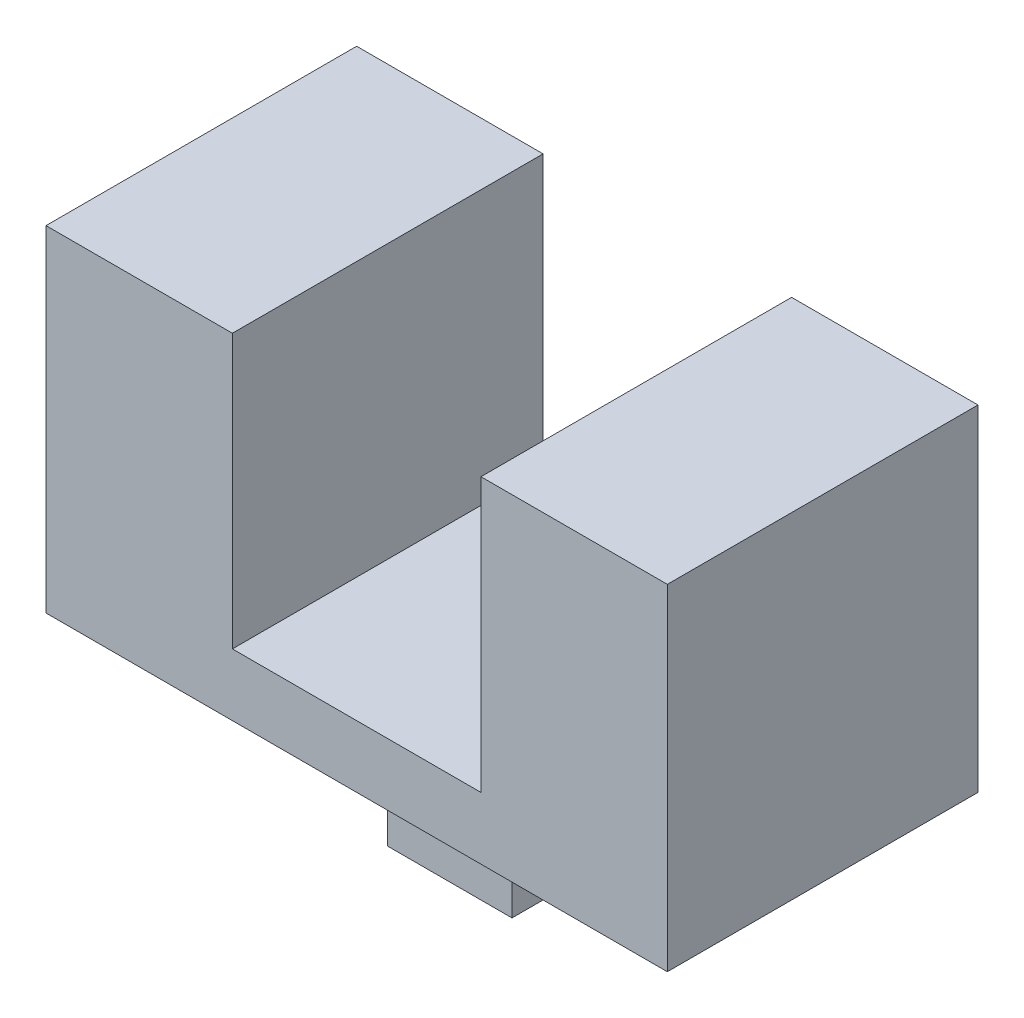
ISO-10303-21;
HEADER;
FILE_DESCRIPTION(('STEP AP214'),'2;1');
FILE_NAME('part.step','',(''),(''),'','','');
FILE_SCHEMA(('AUTOMOTIVE_DESIGN { 1 0 10303 214 1 1 1 1 }'));
ENDSEC;
DATA;
#1=APPLICATION_CONTEXT('core data for automotive mechanical design processes');
#2=APPLICATION_PROTOCOL_DEFINITION('international standard','automotive_design',2000,#1);
#3=PRODUCT_CONTEXT('',#1,'mechanical');
#4=PRODUCT('Part','Part','',(#3));
#5=PRODUCT_RELATED_PRODUCT_CATEGORY('part','',(#4));
#6=PRODUCT_DEFINITION_FORMATION('','',#4);
#7=PRODUCT_DEFINITION_CONTEXT('part definition',#1,'design');
#8=PRODUCT_DEFINITION('design','',#6,#7);
#9=PRODUCT_DEFINITION_SHAPE('','',#8);
#10=(LENGTH_UNIT() NAMED_UNIT(*) SI_UNIT(.MILLI.,.METRE.));
#11=(NAMED_UNIT(*) PLANE_ANGLE_UNIT() SI_UNIT($,.RADIAN.));
#12=(NAMED_UNIT(*) SI_UNIT($,.STERADIAN.) SOLID_ANGLE_UNIT());
#13=UNCERTAINTY_MEASURE_WITH_UNIT(LENGTH_MEASURE(1.E-05),#10,'distance_accuracy_value','');
#14=(GEOMETRIC_REPRESENTATION_CONTEXT(3) GLOBAL_UNCERTAINTY_ASSIGNED_CONTEXT((#13)) GLOBAL_UNIT_ASSIGNED_CONTEXT((#10,
#11,#12)) REPRESENTATION_CONTEXT('',''));
#15=CARTESIAN_POINT('',(0.,0.,0.));
#16=DIRECTION('',(0.,0.,1.));
#17=DIRECTION('',(1.,0.,0.));
#18=AXIS2_PLACEMENT_3D('',#15,#16,#17);
#19=CARTESIAN_POINT('',(6.35,-3.429,6.35));
#20=DIRECTION('',(0.,1.,0.));
#21=DIRECTION('',(-1.,0.,0.));
#22=AXIS2_PLACEMENT_3D('',#19,#20,#21);
#23=PLANE('',#22);
#24=DIRECTION('',(1.,0.,0.));
#25=VECTOR('',#24,1.);
#26=CARTESIAN_POINT('',(6.35,-3.429,0.));
#27=LINE('',#26,#25);
#28=CARTESIAN_POINT('',(-6.35,-3.429,0.));
#29=VERTEX_POINT('',#28);
#30=CARTESIAN_POINT('',(6.35,-3.429,0.));
#31=VERTEX_POINT('',#30);
#32=EDGE_CURVE('E172',#29,#31,#27,.T.);
#33=ORIENTED_EDGE('',*,*,#32,.T.);
#34=DIRECTION('',(0.,0.,-1.));
#35=VECTOR('',#34,1.);
#36=CARTESIAN_POINT('',(6.35,-3.429,6.35));
#37=LINE('',#36,#35);
#38=CARTESIAN_POINT('',(6.35,-3.429,6.35));
#39=VERTEX_POINT('',#38);
#40=EDGE_CURVE('E197',#39,#31,#37,.T.);
#41=ORIENTED_EDGE('',*,*,#40,.F.);
#42=DIRECTION('',(1.,0.,0.));
#43=VECTOR('',#42,1.);
#44=CARTESIAN_POINT('',(6.35,-3.429,6.35));
#45=LINE('',#44,#43);
#46=CARTESIAN_POINT('',(-6.35,-3.429,6.35));
#47=VERTEX_POINT('',#46);
#48=EDGE_CURVE('E158',#47,#39,#45,.T.);
#49=ORIENTED_EDGE('',*,*,#48,.F.);
#50=DIRECTION('',(0.,0.,-1.));
#51=VECTOR('',#50,1.);
#52=CARTESIAN_POINT('',(-6.35,-3.429,6.35));
#53=LINE('',#52,#51);
#54=EDGE_CURVE('E42',#47,#29,#53,.T.);
#55=ORIENTED_EDGE('',*,*,#54,.T.);
#56=EDGE_LOOP('',(#33,#41,#49,#55));
#57=FACE_BOUND('',#56,.T.);
#58=DIRECTION('',(0.,0.,1.));
#59=VECTOR('',#58,1.);
#60=CARTESIAN_POINT('',(1.27,-3.429,1.905));
#61=LINE('',#60,#59);
#62=CARTESIAN_POINT('',(1.27,-3.429,1.905));
#63=VERTEX_POINT('',#62);
#64=CARTESIAN_POINT('',(1.27,-3.429,4.445));
#65=VERTEX_POINT('',#64);
#66=EDGE_CURVE('E49',#63,#65,#61,.T.);
#67=ORIENTED_EDGE('',*,*,#66,.F.);
#68=DIRECTION('',(1.,0.,0.));
#69=VECTOR('',#68,1.);
#70=CARTESIAN_POINT('',(-1.27,-3.429,1.905));
#71=LINE('',#70,#69);
#72=CARTESIAN_POINT('',(-1.27,-3.429,1.905));
#73=VERTEX_POINT('',#72);
#74=EDGE_CURVE('E53',#73,#63,#71,.T.);
#75=ORIENTED_EDGE('',*,*,#74,.F.);
#76=DIRECTION('',(0.,0.,-1.));
#77=VECTOR('',#76,1.);
#78=CARTESIAN_POINT('',(-1.27,-3.429,1.905));
#79=LINE('',#78,#77);
#80=CARTESIAN_POINT('',(-1.27,-3.429,4.445));
#81=VERTEX_POINT('',#80);
#82=EDGE_CURVE('E353',#81,#73,#79,.T.);
#83=ORIENTED_EDGE('',*,*,#82,.F.);
#84=DIRECTION('',(-1.,0.,0.));
#85=VECTOR('',#84,1.);
#86=CARTESIAN_POINT('',(-1.27,-3.429,4.445));
#87=LINE('',#86,#85);
#88=EDGE_CURVE('E359',#65,#81,#87,.T.);
#89=ORIENTED_EDGE('',*,*,#88,.F.);
#90=EDGE_LOOP('',(#67,#75,#83,#89));
#91=FACE_BOUND('',#90,.T.);
#92=ADVANCED_FACE('F34',(#57,#91),#23,.F.);
#93=CARTESIAN_POINT('',(-2.54,3.429,6.35));
#94=DIRECTION('',(0.,-1.,0.));
#95=DIRECTION('',(1.,0.,0.));
#96=AXIS2_PLACEMENT_3D('',#93,#94,#95);
#97=PLANE('',#96);
#98=DIRECTION('',(-1.,0.,0.));
#99=VECTOR('',#98,1.);
#100=CARTESIAN_POINT('',(-2.54,3.429,0.));
#101=LINE('',#100,#99);
#102=CARTESIAN_POINT('',(-2.54,3.429,0.));
#103=VERTEX_POINT('',#102);
#104=CARTESIAN_POINT('',(-6.35,3.429,0.));
#105=VERTEX_POINT('',#104);
#106=EDGE_CURVE('E143',#103,#105,#101,.T.);
#107=ORIENTED_EDGE('',*,*,#106,.T.);
#108=DIRECTION('',(0.,0.,-1.));
#109=VECTOR('',#108,1.);
#110=CARTESIAN_POINT('',(-6.35,3.429,6.35));
#111=LINE('',#110,#109);
#112=CARTESIAN_POINT('',(-6.35,3.429,6.35));
#113=VERTEX_POINT('',#112);
#114=EDGE_CURVE('E11',#113,#105,#111,.T.);
#115=ORIENTED_EDGE('',*,*,#114,.F.);
#116=DIRECTION('',(-1.,0.,0.));
#117=VECTOR('',#116,1.);
#118=CARTESIAN_POINT('',(-2.54,3.429,6.35));
#119=LINE('',#118,#117);
#120=CARTESIAN_POINT('',(-2.54,3.429,6.35));
#121=VERTEX_POINT('',#120);
#122=EDGE_CURVE('E152',#121,#113,#119,.T.);
#123=ORIENTED_EDGE('',*,*,#122,.F.);
#124=DIRECTION('',(0.,0.,-1.));
#125=VECTOR('',#124,1.);
#126=CARTESIAN_POINT('',(-2.54,3.429,6.35));
#127=LINE('',#126,#125);
#128=EDGE_CURVE('E169',#121,#103,#127,.T.);
#129=ORIENTED_EDGE('',*,*,#128,.T.);
#130=EDGE_LOOP('',(#107,#115,#123,#129));
#131=FACE_BOUND('',#130,.T.);
#132=ADVANCED_FACE('F36',(#131),#97,.F.);
#133=CARTESIAN_POINT('',(-6.35,-3.429,6.35));
#134=DIRECTION('',(1.,0.,0.));
#135=DIRECTION('',(0.,0.,-1.));
#136=AXIS2_PLACEMENT_3D('',#133,#134,#135);
#137=PLANE('',#136);
#138=DIRECTION('',(0.,-1.,0.));
#139=VECTOR('',#138,1.);
#140=CARTESIAN_POINT('',(-6.35,-3.429,0.));
#141=LINE('',#140,#139);
#142=EDGE_CURVE('E146',#105,#29,#141,.T.);
#143=ORIENTED_EDGE('',*,*,#142,.T.);
#144=ORIENTED_EDGE('',*,*,#54,.F.);
#145=DIRECTION('',(0.,-1.,0.));
#146=VECTOR('',#145,1.);
#147=CARTESIAN_POINT('',(-6.35,-3.429,6.35));
#148=LINE('',#147,#146);
#149=EDGE_CURVE('E155',#113,#47,#148,.T.);
#150=ORIENTED_EDGE('',*,*,#149,.F.);
#151=ORIENTED_EDGE('',*,*,#114,.T.);
#152=EDGE_LOOP('',(#143,#144,#150,#151));
#153=FACE_BOUND('',#152,.T.);
#154=ADVANCED_FACE('F226',(#153),#137,.F.);
#155=CARTESIAN_POINT('',(6.35,-3.429,6.35));
#156=DIRECTION('',(-1.,0.,0.));
#157=DIRECTION('',(0.,0.,1.));
#158=AXIS2_PLACEMENT_3D('',#155,#156,#157);
#159=PLANE('',#158);
#160=DIRECTION('',(0.,1.,0.));
#161=VECTOR('',#160,1.);
#162=CARTESIAN_POINT('',(6.35,-3.429,0.));
#163=LINE('',#162,#161);
#164=CARTESIAN_POINT('',(6.35,3.429,0.));
#165=VERTEX_POINT('',#164);
#166=EDGE_CURVE('E174',#31,#165,#163,.T.);
#167=ORIENTED_EDGE('',*,*,#166,.T.);
#168=DIRECTION('',(0.,0.,-1.));
#169=VECTOR('',#168,1.);
#170=CARTESIAN_POINT('',(6.35,3.429,6.35));
#171=LINE('',#170,#169);
#172=CARTESIAN_POINT('',(6.35,3.429,6.35));
#173=VERTEX_POINT('',#172);
#174=EDGE_CURVE('E194',#173,#165,#171,.T.);
#175=ORIENTED_EDGE('',*,*,#174,.F.);
#176=DIRECTION('',(0.,1.,0.));
#177=VECTOR('',#176,1.);
#178=CARTESIAN_POINT('',(6.35,-3.429,6.35));
#179=LINE('',#178,#177);
#180=EDGE_CURVE('E160',#39,#173,#179,.T.);
#181=ORIENTED_EDGE('',*,*,#180,.F.);
#182=ORIENTED_EDGE('',*,*,#40,.T.);
#183=EDGE_LOOP('',(#167,#175,#181,#182));
#184=FACE_BOUND('',#183,.T.);
#185=ADVANCED_FACE('F214',(#184),#159,.F.);
#186=CARTESIAN_POINT('',(6.35,3.429,6.35));
#187=DIRECTION('',(0.,-1.,0.));
#188=DIRECTION('',(0.,0.,-1.));
#189=AXIS2_PLACEMENT_3D('',#186,#187,#188);
#190=PLANE('',#189);
#191=DIRECTION('',(-1.,0.,0.));
#192=VECTOR('',#191,1.);
#193=CARTESIAN_POINT('',(6.35,3.429,0.));
#194=LINE('',#193,#192);
#195=CARTESIAN_POINT('',(2.54,3.429,0.));
#196=VERTEX_POINT('',#195);
#197=EDGE_CURVE('E176',#165,#196,#194,.T.);
#198=ORIENTED_EDGE('',*,*,#197,.T.);
#199=DIRECTION('',(0.,0.,-1.));
#200=VECTOR('',#199,1.);
#201=CARTESIAN_POINT('',(2.54,3.429,6.35));
#202=LINE('',#201,#200);
#203=CARTESIAN_POINT('',(2.54,3.429,6.35));
#204=VERTEX_POINT('',#203);
#205=EDGE_CURVE('E191',#204,#196,#202,.T.);
#206=ORIENTED_EDGE('',*,*,#205,.F.);
#207=DIRECTION('',(-1.,0.,0.));
#208=VECTOR('',#207,1.);
#209=CARTESIAN_POINT('',(6.35,3.429,6.35));
#210=LINE('',#209,#208);
#211=EDGE_CURVE('E162',#173,#204,#210,.T.);
#212=ORIENTED_EDGE('',*,*,#211,.F.);
#213=ORIENTED_EDGE('',*,*,#174,.T.);
#214=EDGE_LOOP('',(#198,#206,#212,#213));
#215=FACE_BOUND('',#214,.T.);
#216=ADVANCED_FACE('F218',(#215),#190,.F.);
#217=CARTESIAN_POINT('',(2.54,-2.159,6.35));
#218=DIRECTION('',(1.,0.,0.));
#219=DIRECTION('',(0.,0.,-1.));
#220=AXIS2_PLACEMENT_3D('',#217,#218,#219);
#221=PLANE('',#220);
#222=DIRECTION('',(0.,-1.,0.));
#223=VECTOR('',#222,1.);
#224=CARTESIAN_POINT('',(2.54,-2.159,0.));
#225=LINE('',#224,#223);
#226=CARTESIAN_POINT('',(2.54,-2.159,0.));
#227=VERTEX_POINT('',#226);
#228=EDGE_CURVE('E178',#196,#227,#225,.T.);
#229=ORIENTED_EDGE('',*,*,#228,.T.);
#230=DIRECTION('',(0.,0.,-1.));
#231=VECTOR('',#230,1.);
#232=CARTESIAN_POINT('',(2.54,-2.159,6.35));
#233=LINE('',#232,#231);
#234=CARTESIAN_POINT('',(2.54,-2.159,6.35));
#235=VERTEX_POINT('',#234);
#236=EDGE_CURVE('E188',#235,#227,#233,.T.);
#237=ORIENTED_EDGE('',*,*,#236,.F.);
#238=DIRECTION('',(0.,-1.,0.));
#239=VECTOR('',#238,1.);
#240=CARTESIAN_POINT('',(2.54,-2.159,6.35));
#241=LINE('',#240,#239);
#242=EDGE_CURVE('E164',#204,#235,#241,.T.);
#243=ORIENTED_EDGE('',*,*,#242,.F.);
#244=ORIENTED_EDGE('',*,*,#205,.T.);
#245=EDGE_LOOP('',(#229,#237,#243,#244));
#246=FACE_BOUND('',#245,.T.);
#247=ADVANCED_FACE('F239',(#246),#221,.F.);
#248=CARTESIAN_POINT('',(2.54,-2.159,6.35));
#249=DIRECTION('',(0.,-1.,0.));
#250=DIRECTION('',(1.,0.,0.));
#251=AXIS2_PLACEMENT_3D('',#248,#249,#250);
#252=PLANE('',#251);
#253=DIRECTION('',(-1.,0.,0.));
#254=VECTOR('',#253,1.);
#255=CARTESIAN_POINT('',(2.54,-2.159,0.));
#256=LINE('',#255,#254);
#257=CARTESIAN_POINT('',(-2.54,-2.159,0.));
#258=VERTEX_POINT('',#257);
#259=EDGE_CURVE('E180',#227,#258,#256,.T.);
#260=ORIENTED_EDGE('',*,*,#259,.T.);
#261=DIRECTION('',(0.,0.,-1.));
#262=VECTOR('',#261,1.);
#263=CARTESIAN_POINT('',(-2.54,-2.159,6.35));
#264=LINE('',#263,#262);
#265=CARTESIAN_POINT('',(-2.54,-2.159,6.35));
#266=VERTEX_POINT('',#265);
#267=EDGE_CURVE('E185',#266,#258,#264,.T.);
#268=ORIENTED_EDGE('',*,*,#267,.F.);
#269=DIRECTION('',(-1.,0.,0.));
#270=VECTOR('',#269,1.);
#271=CARTESIAN_POINT('',(2.54,-2.159,6.35));
#272=LINE('',#271,#270);
#273=EDGE_CURVE('E166',#235,#266,#272,.T.);
#274=ORIENTED_EDGE('',*,*,#273,.F.);
#275=ORIENTED_EDGE('',*,*,#236,.T.);
#276=EDGE_LOOP('',(#260,#268,#274,#275));
#277=FACE_BOUND('',#276,.T.);
#278=ADVANCED_FACE('F237',(#277),#252,.F.);
#279=CARTESIAN_POINT('',(-2.54,-2.159,6.35));
#280=DIRECTION('',(-1.,0.,0.));
#281=DIRECTION('',(0.,0.,1.));
#282=AXIS2_PLACEMENT_3D('',#279,#280,#281);
#283=PLANE('',#282);
#284=DIRECTION('',(0.,1.,0.));
#285=VECTOR('',#284,1.);
#286=CARTESIAN_POINT('',(-2.54,-2.159,0.));
#287=LINE('',#286,#285);
#288=EDGE_CURVE('E156',#258,#103,#287,.T.);
#289=ORIENTED_EDGE('',*,*,#288,.T.);
#290=ORIENTED_EDGE('',*,*,#128,.F.);
#291=DIRECTION('',(0.,1.,0.));
#292=VECTOR('',#291,1.);
#293=CARTESIAN_POINT('',(-2.54,-2.159,6.35));
#294=LINE('',#293,#292);
#295=EDGE_CURVE('E168',#266,#121,#294,.T.);
#296=ORIENTED_EDGE('',*,*,#295,.F.);
#297=ORIENTED_EDGE('',*,*,#267,.T.);
#298=EDGE_LOOP('',(#289,#290,#296,#297));
#299=FACE_BOUND('',#298,.T.);
#300=ADVANCED_FACE('F232',(#299),#283,.F.);
#301=CARTESIAN_POINT('',(0.,0.,6.35));
#302=DIRECTION('',(0.,0.,-1.));
#303=DIRECTION('',(-1.,0.,0.));
#304=AXIS2_PLACEMENT_3D('',#301,#302,#303);
#305=PLANE('',#304);
#306=ORIENTED_EDGE('',*,*,#122,.T.);
#307=ORIENTED_EDGE('',*,*,#149,.T.);
#308=ORIENTED_EDGE('',*,*,#48,.T.);
#309=ORIENTED_EDGE('',*,*,#180,.T.);
#310=ORIENTED_EDGE('',*,*,#211,.T.);
#311=ORIENTED_EDGE('',*,*,#242,.T.);
#312=ORIENTED_EDGE('',*,*,#273,.T.);
#313=ORIENTED_EDGE('',*,*,#295,.T.);
#314=EDGE_LOOP('',(#306,#307,#308,#309,#310,#311,#312,#313));
#315=FACE_BOUND('',#314,.T.);
#316=ADVANCED_FACE('F222',(#315),#305,.F.);
#317=CARTESIAN_POINT('',(0.,0.,0.));
#318=DIRECTION('',(0.,0.,-1.));
#319=DIRECTION('',(-1.,0.,0.));
#320=AXIS2_PLACEMENT_3D('',#317,#318,#319);
#321=PLANE('',#320);
#322=ORIENTED_EDGE('',*,*,#106,.F.);
#323=ORIENTED_EDGE('',*,*,#288,.F.);
#324=ORIENTED_EDGE('',*,*,#259,.F.);
#325=ORIENTED_EDGE('',*,*,#228,.F.);
#326=ORIENTED_EDGE('',*,*,#197,.F.);
#327=ORIENTED_EDGE('',*,*,#166,.F.);
#328=ORIENTED_EDGE('',*,*,#32,.F.);
#329=ORIENTED_EDGE('',*,*,#142,.F.);
#330=EDGE_LOOP('',(#322,#323,#324,#325,#326,#327,#328,#329));
#331=FACE_BOUND('',#330,.T.);
#332=ADVANCED_FACE('F209',(#331),#321,.T.);
#333=CARTESIAN_POINT('',(1.27,-5.969,1.905));
#334=DIRECTION('',(-1.,0.,0.));
#335=DIRECTION('',(0.,-1.,0.));
#336=AXIS2_PLACEMENT_3D('',#333,#334,#335);
#337=PLANE('',#336);
#338=ORIENTED_EDGE('',*,*,#66,.T.);
#339=DIRECTION('',(0.,1.,0.));
#340=VECTOR('',#339,1.);
#341=CARTESIAN_POINT('',(1.27,-5.969,4.445));
#342=LINE('',#341,#340);
#343=CARTESIAN_POINT('',(1.27,-5.969,4.445));
#344=VERTEX_POINT('',#343);
#345=EDGE_CURVE('E126',#344,#65,#342,.T.);
#346=ORIENTED_EDGE('',*,*,#345,.F.);
#347=DIRECTION('',(0.,0.,1.));
#348=VECTOR('',#347,1.);
#349=CARTESIAN_POINT('',(1.27,-5.969,1.905));
#350=LINE('',#349,#348);
#351=CARTESIAN_POINT('',(1.27,-5.969,1.905));
#352=VERTEX_POINT('',#351);
#353=EDGE_CURVE('E132',#352,#344,#350,.T.);
#354=ORIENTED_EDGE('',*,*,#353,.F.);
#355=DIRECTION('',(0.,1.,0.));
#356=VECTOR('',#355,1.);
#357=CARTESIAN_POINT('',(1.27,-5.969,1.905));
#358=LINE('',#357,#356);
#359=EDGE_CURVE('E351',#352,#63,#358,.T.);
#360=ORIENTED_EDGE('',*,*,#359,.T.);
#361=EDGE_LOOP('',(#338,#346,#354,#360));
#362=FACE_BOUND('',#361,.T.);
#363=ADVANCED_FACE('F142',(#362),#337,.F.);
#364=CARTESIAN_POINT('',(-1.27,-5.969,4.445));
#365=DIRECTION('',(0.,0.,-1.));
#366=DIRECTION('',(-1.,0.,0.));
#367=AXIS2_PLACEMENT_3D('',#364,#365,#366);
#368=PLANE('',#367);
#369=ORIENTED_EDGE('',*,*,#88,.T.);
#370=DIRECTION('',(0.,1.,0.));
#371=VECTOR('',#370,1.);
#372=CARTESIAN_POINT('',(-1.27,-5.969,4.445));
#373=LINE('',#372,#371);
#374=CARTESIAN_POINT('',(-1.27,-5.969,4.445));
#375=VERTEX_POINT('',#374);
#376=EDGE_CURVE('E128',#375,#81,#373,.T.);
#377=ORIENTED_EDGE('',*,*,#376,.F.);
#378=DIRECTION('',(-1.,0.,0.));
#379=VECTOR('',#378,1.);
#380=CARTESIAN_POINT('',(-1.27,-5.969,4.445));
#381=LINE('',#380,#379);
#382=EDGE_CURVE('E121',#344,#375,#381,.T.);
#383=ORIENTED_EDGE('',*,*,#382,.F.);
#384=ORIENTED_EDGE('',*,*,#345,.T.);
#385=EDGE_LOOP('',(#369,#377,#383,#384));
#386=FACE_BOUND('',#385,.T.);
#387=ADVANCED_FACE('F124',(#386),#368,.F.);
#388=CARTESIAN_POINT('',(-1.27,-5.969,1.905));
#389=DIRECTION('',(1.,0.,0.));
#390=DIRECTION('',(0.,1.,0.));
#391=AXIS2_PLACEMENT_3D('',#388,#389,#390);
#392=PLANE('',#391);
#393=ORIENTED_EDGE('',*,*,#82,.T.);
#394=DIRECTION('',(0.,1.,0.));
#395=VECTOR('',#394,1.);
#396=CARTESIAN_POINT('',(-1.27,-5.969,1.905));
#397=LINE('',#396,#395);
#398=CARTESIAN_POINT('',(-1.27,-5.969,1.905));
#399=VERTEX_POINT('',#398);
#400=EDGE_CURVE('E148',#399,#73,#397,.T.);
#401=ORIENTED_EDGE('',*,*,#400,.F.);
#402=DIRECTION('',(0.,0.,-1.));
#403=VECTOR('',#402,1.);
#404=CARTESIAN_POINT('',(-1.27,-5.969,1.905));
#405=LINE('',#404,#403);
#406=EDGE_CURVE('E131',#375,#399,#405,.T.);
#407=ORIENTED_EDGE('',*,*,#406,.F.);
#408=ORIENTED_EDGE('',*,*,#376,.T.);
#409=EDGE_LOOP('',(#393,#401,#407,#408));
#410=FACE_BOUND('',#409,.T.);
#411=ADVANCED_FACE('F319',(#410),#392,.F.);
#412=CARTESIAN_POINT('',(-1.27,-5.969,1.905));
#413=DIRECTION('',(0.,0.,1.));
#414=DIRECTION('',(1.,0.,0.));
#415=AXIS2_PLACEMENT_3D('',#412,#413,#414);
#416=PLANE('',#415);
#417=ORIENTED_EDGE('',*,*,#74,.T.);
#418=ORIENTED_EDGE('',*,*,#359,.F.);
#419=DIRECTION('',(1.,0.,0.));
#420=VECTOR('',#419,1.);
#421=CARTESIAN_POINT('',(-1.27,-5.969,1.905));
#422=LINE('',#421,#420);
#423=EDGE_CURVE('E137',#399,#352,#422,.T.);
#424=ORIENTED_EDGE('',*,*,#423,.F.);
#425=ORIENTED_EDGE('',*,*,#400,.T.);
#426=EDGE_LOOP('',(#417,#418,#424,#425));
#427=FACE_BOUND('',#426,.T.);
#428=ADVANCED_FACE('F328',(#427),#416,.F.);
#429=CARTESIAN_POINT('',(0.,-5.969,0.));
#430=DIRECTION('',(0.,1.,0.));
#431=DIRECTION('',(0.,0.,1.));
#432=AXIS2_PLACEMENT_3D('',#429,#430,#431);
#433=PLANE('',#432);
#434=ORIENTED_EDGE('',*,*,#353,.T.);
#435=ORIENTED_EDGE('',*,*,#382,.T.);
#436=ORIENTED_EDGE('',*,*,#406,.T.);
#437=ORIENTED_EDGE('',*,*,#423,.T.);
#438=EDGE_LOOP('',(#434,#435,#436,#437));
#439=FACE_BOUND('',#438,.T.);
#440=ADVANCED_FACE('F135',(#439),#433,.F.);
#441=CLOSED_SHELL('',(#92,#132,#154,#185,#216,#247,#278,#300,#316,#332,#363,#387,#411,#428,#440));
#442=MANIFOLD_SOLID_BREP('B2',#441);
#443=ADVANCED_BREP_SHAPE_REPRESENTATION('',(#18,#442),#14);
#444=SHAPE_DEFINITION_REPRESENTATION(#9,#443);
ENDSEC;
END-ISO-10303-21;
